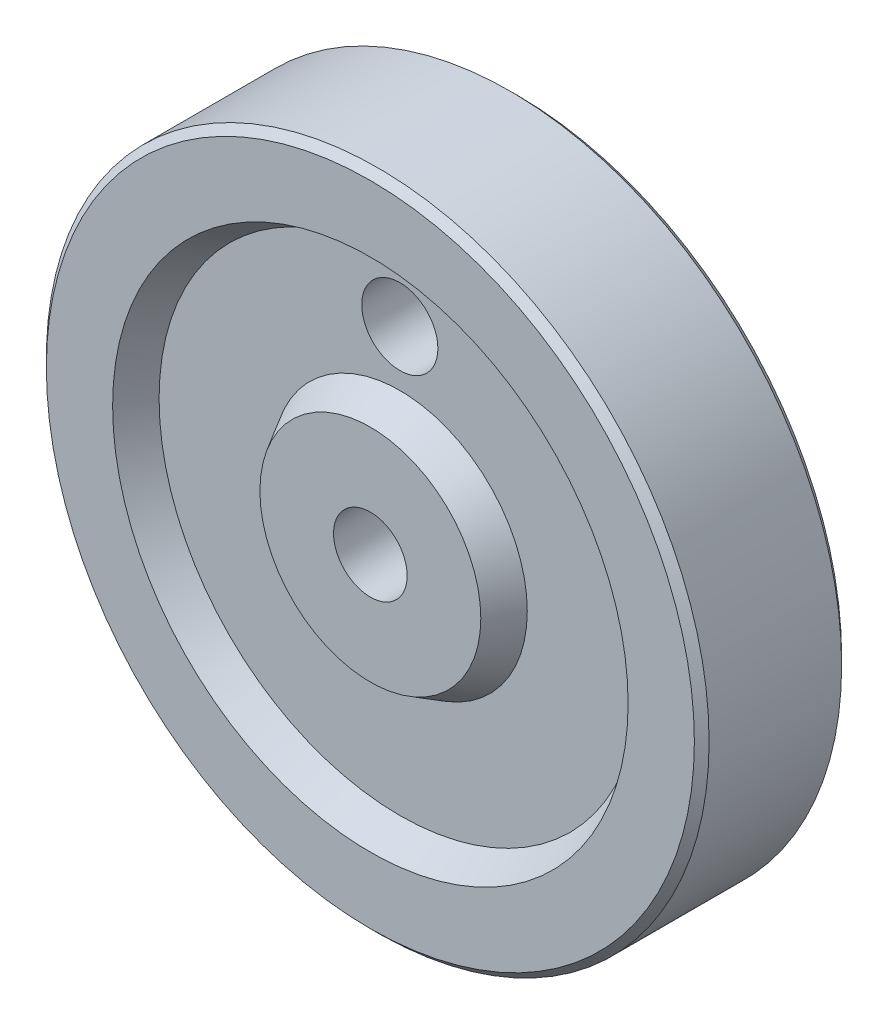
ISO-10303-21;
HEADER;
FILE_DESCRIPTION(('STEP AP214'),'2;1');
FILE_NAME('part.step','',(''),(''),'','','');
FILE_SCHEMA(('AUTOMOTIVE_DESIGN { 1 0 10303 214 1 1 1 1 }'));
ENDSEC;
DATA;
#1=APPLICATION_CONTEXT('core data for automotive mechanical design processes');
#2=APPLICATION_PROTOCOL_DEFINITION('international standard','automotive_design',2000,#1);
#3=PRODUCT_CONTEXT('',#1,'mechanical');
#4=PRODUCT('Part','Part','',(#3));
#5=PRODUCT_RELATED_PRODUCT_CATEGORY('part','',(#4));
#6=PRODUCT_DEFINITION_FORMATION('','',#4);
#7=PRODUCT_DEFINITION_CONTEXT('part definition',#1,'design');
#8=PRODUCT_DEFINITION('design','',#6,#7);
#9=PRODUCT_DEFINITION_SHAPE('','',#8);
#10=(LENGTH_UNIT() NAMED_UNIT(*) SI_UNIT(.MILLI.,.METRE.));
#11=(NAMED_UNIT(*) PLANE_ANGLE_UNIT() SI_UNIT($,.RADIAN.));
#12=(NAMED_UNIT(*) SI_UNIT($,.STERADIAN.) SOLID_ANGLE_UNIT());
#13=UNCERTAINTY_MEASURE_WITH_UNIT(LENGTH_MEASURE(1.E-05),#10,'distance_accuracy_value','');
#14=(GEOMETRIC_REPRESENTATION_CONTEXT(3) GLOBAL_UNCERTAINTY_ASSIGNED_CONTEXT((#13)) GLOBAL_UNIT_ASSIGNED_CONTEXT((#10,
#11,#12)) REPRESENTATION_CONTEXT('',''));
#15=CARTESIAN_POINT('',(0.,0.,0.));
#16=DIRECTION('',(0.,0.,1.));
#17=DIRECTION('',(1.,0.,0.));
#18=AXIS2_PLACEMENT_3D('',#15,#16,#17);
#19=CARTESIAN_POINT('',(0.,0.,-50.));
#20=DIRECTION('',(0.,0.,1.));
#21=DIRECTION('',(1.,0.,0.));
#22=AXIS2_PLACEMENT_3D('',#19,#20,#21);
#23=PLANE('',#22);
#24=CARTESIAN_POINT('',(0.,0.,-50.));
#25=DIRECTION('',(0.,0.,1.));
#26=DIRECTION('',(1.,0.,0.));
#27=AXIS2_PLACEMENT_3D('',#24,#25,#26);
#28=CIRCLE('',#27,220.);
#29=CARTESIAN_POINT('',(220.,0.,-50.));
#30=VERTEX_POINT('',#29);
#31=EDGE_CURVE('E52',#30,#30,#28,.F.);
#32=ORIENTED_EDGE('',*,*,#31,.T.);
#33=EDGE_LOOP('',(#32));
#34=FACE_BOUND('',#33,.T.);
#35=CARTESIAN_POINT('',(0.,0.,-50.));
#36=DIRECTION('',(0.,0.,1.));
#37=DIRECTION('',(1.,0.,0.));
#38=AXIS2_PLACEMENT_3D('',#35,#36,#37);
#39=CIRCLE('',#38,175.);
#40=CARTESIAN_POINT('',(175.,0.,-50.));
#41=VERTEX_POINT('',#40);
#42=EDGE_CURVE('E86',#41,#41,#39,.T.);
#43=ORIENTED_EDGE('',*,*,#42,.T.);
#44=EDGE_LOOP('',(#43));
#45=FACE_BOUND('',#44,.T.);
#46=ADVANCED_FACE('F44',(#34,#45),#23,.F.);
#47=CARTESIAN_POINT('',(0.,0.,50.));
#48=DIRECTION('',(0.,0.,1.));
#49=DIRECTION('',(1.,0.,0.));
#50=AXIS2_PLACEMENT_3D('',#47,#48,#49);
#51=PLANE('',#50);
#52=CARTESIAN_POINT('',(0.,0.,50.));
#53=DIRECTION('',(0.,0.,1.));
#54=DIRECTION('',(1.,0.,0.));
#55=AXIS2_PLACEMENT_3D('',#52,#53,#54);
#56=CIRCLE('',#55,25.);
#57=CARTESIAN_POINT('',(25.,0.,50.));
#58=VERTEX_POINT('',#57);
#59=EDGE_CURVE('E65',#58,#58,#56,.T.);
#60=ORIENTED_EDGE('',*,*,#59,.F.);
#61=EDGE_LOOP('',(#60));
#62=FACE_BOUND('',#61,.T.);
#63=CARTESIAN_POINT('',(0.,0.,50.));
#64=DIRECTION('',(0.,0.,1.));
#65=DIRECTION('',(1.,0.,0.));
#66=AXIS2_PLACEMENT_3D('',#63,#64,#65);
#67=CIRCLE('',#66,75.);
#68=CARTESIAN_POINT('',(75.,0.,50.));
#69=VERTEX_POINT('',#68);
#70=EDGE_CURVE('E77',#69,#69,#67,.T.);
#71=ORIENTED_EDGE('',*,*,#70,.T.);
#72=EDGE_LOOP('',(#71));
#73=FACE_BOUND('',#72,.T.);
#74=ADVANCED_FACE('F134',(#62,#73),#51,.T.);
#75=CARTESIAN_POINT('',(0.,0.,50.));
#76=DIRECTION('',(0.,0.,-1.));
#77=DIRECTION('',(-1.,0.,0.));
#78=AXIS2_PLACEMENT_3D('',#75,#76,#77);
#79=CYLINDRICAL_SURFACE('',#78,225.);
#80=CARTESIAN_POINT('',(0.,0.,-44.9999999999999));
#81=DIRECTION('',(0.,0.,1.));
#82=DIRECTION('',(1.,0.,0.));
#83=AXIS2_PLACEMENT_3D('',#80,#81,#82);
#84=CIRCLE('',#83,225.);
#85=CARTESIAN_POINT('',(225.,0.,-44.9999999999999));
#86=VERTEX_POINT('',#85);
#87=EDGE_CURVE('E56',#86,#86,#84,.T.);
#88=ORIENTED_EDGE('',*,*,#87,.T.);
#89=EDGE_LOOP('',(#88));
#90=FACE_BOUND('',#89,.T.);
#91=CARTESIAN_POINT('',(0.,0.,44.9999999999999));
#92=DIRECTION('',(0.,0.,1.));
#93=DIRECTION('',(1.,0.,0.));
#94=AXIS2_PLACEMENT_3D('',#91,#92,#93);
#95=CIRCLE('',#94,225.);
#96=CARTESIAN_POINT('',(225.,0.,44.9999999999999));
#97=VERTEX_POINT('',#96);
#98=EDGE_CURVE('E61',#97,#97,#95,.F.);
#99=ORIENTED_EDGE('',*,*,#98,.T.);
#100=EDGE_LOOP('',(#99));
#101=FACE_BOUND('',#100,.T.);
#102=ADVANCED_FACE('F137',(#90,#101),#79,.T.);
#103=CARTESIAN_POINT('',(0.,0.,50.));
#104=DIRECTION('',(0.,0.,1.));
#105=DIRECTION('',(1.,0.,0.));
#106=AXIS2_PLACEMENT_3D('',#103,#104,#105);
#107=CIRCLE('',#106,220.);
#108=CARTESIAN_POINT('',(220.,0.,50.));
#109=VERTEX_POINT('',#108);
#110=EDGE_CURVE('E12',#109,#109,#107,.T.);
#111=ORIENTED_EDGE('',*,*,#110,.T.);
#112=EDGE_LOOP('',(#111));
#113=FACE_BOUND('',#112,.T.);
#114=CARTESIAN_POINT('',(0.,0.,50.));
#115=DIRECTION('',(0.,0.,1.));
#116=DIRECTION('',(1.,0.,0.));
#117=AXIS2_PLACEMENT_3D('',#114,#115,#116);
#118=CIRCLE('',#117,175.);
#119=CARTESIAN_POINT('',(175.,0.,50.));
#120=VERTEX_POINT('',#119);
#121=EDGE_CURVE('E73',#120,#120,#118,.T.);
#122=ORIENTED_EDGE('',*,*,#121,.F.);
#123=EDGE_LOOP('',(#122));
#124=FACE_BOUND('',#123,.T.);
#125=ADVANCED_FACE('F124',(#113,#124),#51,.T.);
#126=CARTESIAN_POINT('',(0.,0.,-50.));
#127=DIRECTION('',(0.,0.,1.));
#128=DIRECTION('',(1.,0.,0.));
#129=AXIS2_PLACEMENT_3D('',#126,#127,#128);
#130=CIRCLE('',#129,75.);
#131=CARTESIAN_POINT('',(75.,0.,-50.));
#132=VERTEX_POINT('',#131);
#133=EDGE_CURVE('E87',#132,#132,#130,.T.);
#134=ORIENTED_EDGE('',*,*,#133,.F.);
#135=EDGE_LOOP('',(#134));
#136=FACE_BOUND('',#135,.T.);
#137=CARTESIAN_POINT('',(0.,0.,-50.));
#138=DIRECTION('',(0.,0.,1.));
#139=DIRECTION('',(1.,0.,0.));
#140=AXIS2_PLACEMENT_3D('',#137,#138,#139);
#141=CIRCLE('',#140,25.);
#142=CARTESIAN_POINT('',(25.,0.,-50.));
#143=VERTEX_POINT('',#142);
#144=EDGE_CURVE('E64',#143,#143,#141,.T.);
#145=ORIENTED_EDGE('',*,*,#144,.T.);
#146=EDGE_LOOP('',(#145));
#147=FACE_BOUND('',#146,.T.);
#148=ADVANCED_FACE('F120',(#136,#147),#23,.F.);
#149=CARTESIAN_POINT('',(0.,0.,-50.));
#150=DIRECTION('',(0.,0.,1.));
#151=DIRECTION('',(1.,0.,0.));
#152=AXIS2_PLACEMENT_3D('',#149,#150,#151);
#153=CYLINDRICAL_SURFACE('',#152,25.);
#154=ORIENTED_EDGE('',*,*,#144,.F.);
#155=EDGE_LOOP('',(#154));
#156=FACE_BOUND('',#155,.T.);
#157=ORIENTED_EDGE('',*,*,#59,.T.);
#158=EDGE_LOOP('',(#157));
#159=FACE_BOUND('',#158,.T.);
#160=ADVANCED_FACE('F123',(#156,#159),#153,.F.);
#161=CARTESIAN_POINT('',(0.,0.,50.));
#162=DIRECTION('',(0.,0.,1.));
#163=DIRECTION('',(1.,0.,0.));
#164=AXIS2_PLACEMENT_3D('',#161,#162,#163);
#165=CONICAL_SURFACE('',#164,175.,0.5235987755983);
#166=CARTESIAN_POINT('',(0.,0.,30.));
#167=DIRECTION('',(0.,0.,1.));
#168=DIRECTION('',(1.,0.,0.));
#169=AXIS2_PLACEMENT_3D('',#166,#167,#168);
#170=CIRCLE('',#169,163.452994616207);
#171=CARTESIAN_POINT('',(163.452994616207,0.,30.));
#172=VERTEX_POINT('',#171);
#173=EDGE_CURVE('E68',#172,#172,#170,.T.);
#174=ORIENTED_EDGE('',*,*,#173,.F.);
#175=EDGE_LOOP('',(#174));
#176=FACE_BOUND('',#175,.T.);
#177=ORIENTED_EDGE('',*,*,#121,.T.);
#178=EDGE_LOOP('',(#177));
#179=FACE_BOUND('',#178,.T.);
#180=ADVANCED_FACE('F130',(#176,#179),#165,.F.);
#181=CARTESIAN_POINT('',(0.,0.,30.));
#182=DIRECTION('',(0.,0.,1.));
#183=DIRECTION('',(1.,0.,0.));
#184=AXIS2_PLACEMENT_3D('',#181,#182,#183);
#185=PLANE('',#184);
#186=CARTESIAN_POINT('',(0.,124.095015256352,30.));
#187=DIRECTION('',(0.,0.,1.));
#188=DIRECTION('',(1.,0.,0.));
#189=AXIS2_PLACEMENT_3D('',#186,#187,#188);
#190=CIRCLE('',#189,25.8523513766343);
#191=CARTESIAN_POINT('',(25.8523513766343,124.095015256352,30.));
#192=VERTEX_POINT('',#191);
#193=EDGE_CURVE('E94',#192,#192,#190,.T.);
#194=ORIENTED_EDGE('',*,*,#193,.F.);
#195=EDGE_LOOP('',(#194));
#196=FACE_BOUND('',#195,.T.);
#197=CARTESIAN_POINT('',(0.,0.,30.));
#198=DIRECTION('',(0.,0.,1.));
#199=DIRECTION('',(1.,0.,0.));
#200=AXIS2_PLACEMENT_3D('',#197,#198,#199);
#201=CIRCLE('',#200,86.5470053837926);
#202=CARTESIAN_POINT('',(86.5470053837926,0.,30.));
#203=VERTEX_POINT('',#202);
#204=EDGE_CURVE('E74',#203,#203,#201,.T.);
#205=ORIENTED_EDGE('',*,*,#204,.F.);
#206=EDGE_LOOP('',(#205));
#207=FACE_BOUND('',#206,.T.);
#208=ORIENTED_EDGE('',*,*,#173,.T.);
#209=EDGE_LOOP('',(#208));
#210=FACE_BOUND('',#209,.T.);
#211=ADVANCED_FACE('F142',(#196,#207,#210),#185,.T.);
#212=CARTESIAN_POINT('',(0.,0.,50.));
#213=DIRECTION('',(0.,0.,-1.));
#214=DIRECTION('',(1.,0.,0.));
#215=AXIS2_PLACEMENT_3D('',#212,#213,#214);
#216=CONICAL_SURFACE('',#215,75.,0.5235987755983);
#217=ORIENTED_EDGE('',*,*,#204,.T.);
#218=EDGE_LOOP('',(#217));
#219=FACE_BOUND('',#218,.T.);
#220=ORIENTED_EDGE('',*,*,#70,.F.);
#221=EDGE_LOOP('',(#220));
#222=FACE_BOUND('',#221,.T.);
#223=ADVANCED_FACE('F107',(#219,#222),#216,.T.);
#224=CARTESIAN_POINT('',(0.,0.,-30.));
#225=DIRECTION('',(0.,0.,-1.));
#226=DIRECTION('',(1.,0.,0.));
#227=AXIS2_PLACEMENT_3D('',#224,#225,#226);
#228=PLANE('',#227);
#229=CARTESIAN_POINT('',(0.,124.095015256352,-30.));
#230=DIRECTION('',(0.,0.,-1.));
#231=DIRECTION('',(-1.,0.,0.));
#232=AXIS2_PLACEMENT_3D('',#229,#230,#231);
#233=CIRCLE('',#232,25.8523513766343);
#234=CARTESIAN_POINT('',(-25.8523513766343,124.095015256352,-30.));
#235=VERTEX_POINT('',#234);
#236=EDGE_CURVE('E48',#235,#235,#233,.T.);
#237=ORIENTED_EDGE('',*,*,#236,.F.);
#238=EDGE_LOOP('',(#237));
#239=FACE_BOUND('',#238,.T.);
#240=CARTESIAN_POINT('',(0.,0.,-30.));
#241=DIRECTION('',(0.,0.,-1.));
#242=DIRECTION('',(-1.,0.,0.));
#243=AXIS2_PLACEMENT_3D('',#240,#241,#242);
#244=CIRCLE('',#243,163.452994616207);
#245=CARTESIAN_POINT('',(-163.452994616207,0.,-30.));
#246=VERTEX_POINT('',#245);
#247=EDGE_CURVE('E82',#246,#246,#244,.F.);
#248=ORIENTED_EDGE('',*,*,#247,.F.);
#249=EDGE_LOOP('',(#248));
#250=FACE_BOUND('',#249,.T.);
#251=CARTESIAN_POINT('',(0.,0.,-30.));
#252=DIRECTION('',(0.,0.,-1.));
#253=DIRECTION('',(-1.,0.,0.));
#254=AXIS2_PLACEMENT_3D('',#251,#252,#253);
#255=CIRCLE('',#254,86.5470053837926);
#256=CARTESIAN_POINT('',(-86.5470053837926,0.,-30.));
#257=VERTEX_POINT('',#256);
#258=EDGE_CURVE('E83',#257,#257,#255,.F.);
#259=ORIENTED_EDGE('',*,*,#258,.T.);
#260=EDGE_LOOP('',(#259));
#261=FACE_BOUND('',#260,.T.);
#262=ADVANCED_FACE('F103',(#239,#250,#261),#228,.T.);
#263=CARTESIAN_POINT('',(0.,0.,-50.));
#264=DIRECTION('',(0.,0.,-1.));
#265=DIRECTION('',(1.,0.,0.));
#266=AXIS2_PLACEMENT_3D('',#263,#264,#265);
#267=CONICAL_SURFACE('',#266,175.,0.5235987755983);
#268=ORIENTED_EDGE('',*,*,#247,.T.);
#269=EDGE_LOOP('',(#268));
#270=FACE_BOUND('',#269,.T.);
#271=ORIENTED_EDGE('',*,*,#42,.F.);
#272=EDGE_LOOP('',(#271));
#273=FACE_BOUND('',#272,.T.);
#274=ADVANCED_FACE('F106',(#270,#273),#267,.F.);
#275=CARTESIAN_POINT('',(0.,0.,-50.));
#276=DIRECTION('',(0.,0.,1.));
#277=DIRECTION('',(1.,0.,0.));
#278=AXIS2_PLACEMENT_3D('',#275,#276,#277);
#279=CONICAL_SURFACE('',#278,75.,0.5235987755983);
#280=ORIENTED_EDGE('',*,*,#258,.F.);
#281=EDGE_LOOP('',(#280));
#282=FACE_BOUND('',#281,.T.);
#283=ORIENTED_EDGE('',*,*,#133,.T.);
#284=EDGE_LOOP('',(#283));
#285=FACE_BOUND('',#284,.T.);
#286=ADVANCED_FACE('F113',(#282,#285),#279,.T.);
#287=CARTESIAN_POINT('',(0.,0.,-44.9999999999999));
#288=DIRECTION('',(0.,0.,1.));
#289=DIRECTION('',(1.,0.,0.));
#290=AXIS2_PLACEMENT_3D('',#287,#288,#289);
#291=CONICAL_SURFACE('',#290,225.,0.785398163397448);
#292=ORIENTED_EDGE('',*,*,#31,.F.);
#293=EDGE_LOOP('',(#292));
#294=FACE_BOUND('',#293,.T.);
#295=ORIENTED_EDGE('',*,*,#87,.F.);
#296=EDGE_LOOP('',(#295));
#297=FACE_BOUND('',#296,.T.);
#298=ADVANCED_FACE('F116',(#294,#297),#291,.T.);
#299=CARTESIAN_POINT('',(0.,0.,50.));
#300=DIRECTION('',(0.,0.,-1.));
#301=DIRECTION('',(-1.,0.,0.));
#302=AXIS2_PLACEMENT_3D('',#299,#300,#301);
#303=CONICAL_SURFACE('',#302,220.,0.785398163397443);
#304=ORIENTED_EDGE('',*,*,#98,.F.);
#305=EDGE_LOOP('',(#304));
#306=FACE_BOUND('',#305,.T.);
#307=ORIENTED_EDGE('',*,*,#110,.F.);
#308=EDGE_LOOP('',(#307));
#309=FACE_BOUND('',#308,.T.);
#310=ADVANCED_FACE('F46',(#306,#309),#303,.T.);
#311=CARTESIAN_POINT('',(0.,124.095015256352,-50.));
#312=DIRECTION('',(0.,0.,1.));
#313=DIRECTION('',(1.,0.,0.));
#314=AXIS2_PLACEMENT_3D('',#311,#312,#313);
#315=CYLINDRICAL_SURFACE('',#314,25.8523513766343);
#316=ORIENTED_EDGE('',*,*,#236,.T.);
#317=EDGE_LOOP('',(#316));
#318=FACE_BOUND('',#317,.T.);
#319=ORIENTED_EDGE('',*,*,#193,.T.);
#320=EDGE_LOOP('',(#319));
#321=FACE_BOUND('',#320,.T.);
#322=ADVANCED_FACE('F101',(#318,#321),#315,.F.);
#323=CLOSED_SHELL('',(#46,#74,#102,#125,#148,#160,#180,#211,#223,#262,#274,#286,#298,#310,#322));
#324=MANIFOLD_SOLID_BREP('B2',#323);
#325=ADVANCED_BREP_SHAPE_REPRESENTATION('',(#18,#324),#14);
#326=SHAPE_DEFINITION_REPRESENTATION(#9,#325);
ENDSEC;
END-ISO-10303-21;
